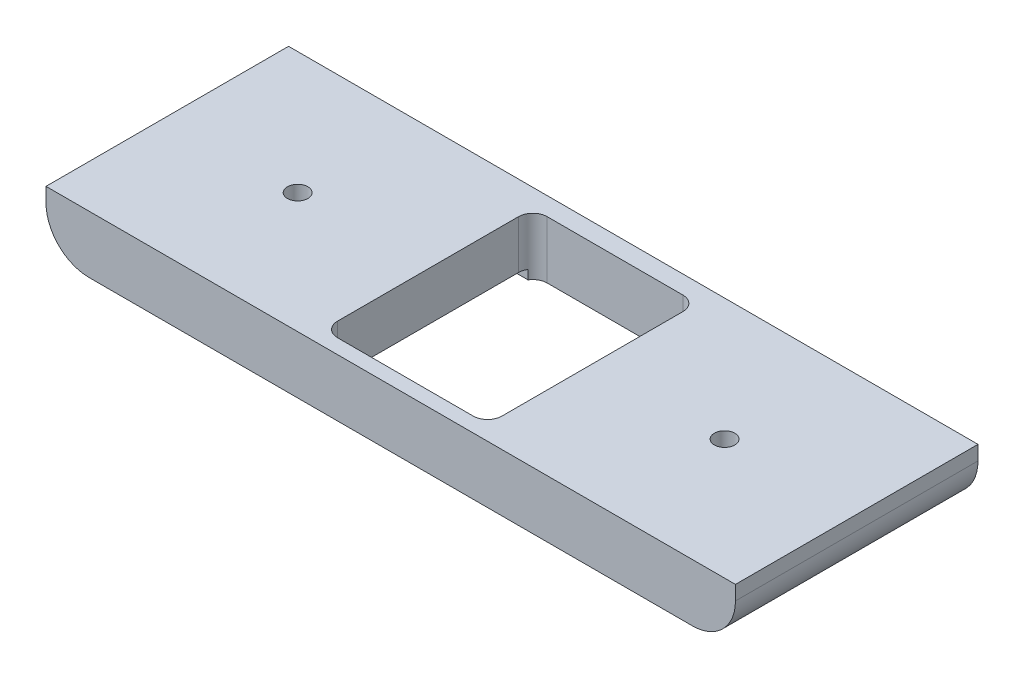
ISO-10303-21;
HEADER;
FILE_DESCRIPTION(('STEP AP214'),'2;1');
FILE_NAME('part.step','',(''),(''),'','','');
FILE_SCHEMA(('AUTOMOTIVE_DESIGN { 1 0 10303 214 1 1 1 1 }'));
ENDSEC;
DATA;
#1=APPLICATION_CONTEXT('core data for automotive mechanical design processes');
#2=APPLICATION_PROTOCOL_DEFINITION('international standard','automotive_design',2000,#1);
#3=PRODUCT_CONTEXT('',#1,'mechanical');
#4=PRODUCT('Part','Part','',(#3));
#5=PRODUCT_RELATED_PRODUCT_CATEGORY('part','',(#4));
#6=PRODUCT_DEFINITION_FORMATION('','',#4);
#7=PRODUCT_DEFINITION_CONTEXT('part definition',#1,'design');
#8=PRODUCT_DEFINITION('design','',#6,#7);
#9=PRODUCT_DEFINITION_SHAPE('','',#8);
#10=(LENGTH_UNIT() NAMED_UNIT(*) SI_UNIT(.MILLI.,.METRE.));
#11=(NAMED_UNIT(*) PLANE_ANGLE_UNIT() SI_UNIT($,.RADIAN.));
#12=(NAMED_UNIT(*) SI_UNIT($,.STERADIAN.) SOLID_ANGLE_UNIT());
#13=UNCERTAINTY_MEASURE_WITH_UNIT(LENGTH_MEASURE(1.E-05),#10,'distance_accuracy_value','');
#14=(GEOMETRIC_REPRESENTATION_CONTEXT(3) GLOBAL_UNCERTAINTY_ASSIGNED_CONTEXT((#13)) GLOBAL_UNIT_ASSIGNED_CONTEXT((#10,
#11,#12)) REPRESENTATION_CONTEXT('',''));
#15=CARTESIAN_POINT('',(0.,0.,0.));
#16=DIRECTION('',(0.,0.,1.));
#17=DIRECTION('',(1.,0.,0.));
#18=AXIS2_PLACEMENT_3D('',#15,#16,#17);
#19=CARTESIAN_POINT('',(-58.9313034977755,0.,4.12929788129206));
#20=DIRECTION('',(0.,0.,1.));
#21=DIRECTION('',(1.,0.,0.));
#22=AXIS2_PLACEMENT_3D('',#19,#20,#21);
#23=PLANE('',#22);
#24=DIRECTION('',(1.,0.,0.));
#25=VECTOR('',#24,1.);
#26=CARTESIAN_POINT('',(-58.9313034977755,0.,4.12929788129206));
#27=LINE('',#26,#25);
#28=CARTESIAN_POINT('',(-11.9750102956986,0.,4.12929788129206));
#29=VERTEX_POINT('',#28);
#30=CARTESIAN_POINT('',(12.5061965022245,0.,4.12929788129206));
#31=VERTEX_POINT('',#30);
#32=EDGE_CURVE('E271',#29,#31,#27,.T.);
#33=ORIENTED_EDGE('',*,*,#32,.F.);
#34=DIRECTION('',(0.,-1.,0.));
#35=VECTOR('',#34,1.);
#36=CARTESIAN_POINT('',(-11.9750102956986,6.35,4.12929788129206));
#37=LINE('',#36,#35);
#38=CARTESIAN_POINT('',(-11.9750102956986,1.,4.12929788129206));
#39=VERTEX_POINT('',#38);
#40=EDGE_CURVE('E193',#29,#39,#37,.F.);
#41=ORIENTED_EDGE('',*,*,#40,.T.);
#42=DIRECTION('',(1.,0.,0.));
#43=VECTOR('',#42,1.);
#44=CARTESIAN_POINT('',(-58.9313034977755,1.,4.12929788129206));
#45=LINE('',#44,#43);
#46=CARTESIAN_POINT('',(15.4259567663557,1.,4.12929788129206));
#47=VERTEX_POINT('',#46);
#48=EDGE_CURVE('E275',#39,#47,#45,.T.);
#49=ORIENTED_EDGE('',*,*,#48,.T.);
#50=CARTESIAN_POINT('',(12.5061965022245,4.7625,4.12929788129206));
#51=DIRECTION('',(0.,0.,1.));
#52=DIRECTION('',(1.,0.,0.));
#53=AXIS2_PLACEMENT_3D('',#50,#51,#52);
#54=CIRCLE('',#53,4.7625);
#55=EDGE_CURVE('E288',#47,#31,#54,.F.);
#56=ORIENTED_EDGE('',*,*,#55,.T.);
#57=EDGE_LOOP('',(#33,#41,#49,#56));
#58=FACE_BOUND('',#57,.T.);
#59=ADVANCED_FACE('F36',(#58),#23,.F.);
#60=CARTESIAN_POINT('',(-58.9313034977755,1.,4.12929788129206));
#61=DIRECTION('',(0.,1.,0.));
#62=DIRECTION('',(0.,0.,1.));
#63=AXIS2_PLACEMENT_3D('',#60,#61,#62);
#64=PLANE('',#63);
#65=CARTESIAN_POINT('',(2.76244650222446,1.,-6.79492086870787));
#66=DIRECTION('',(0.,1.,0.));
#67=DIRECTION('',(0.,0.,1.));
#68=AXIS2_PLACEMENT_3D('',#65,#66,#67);
#69=CIRCLE('',#68,1.13029999999999);
#70=CARTESIAN_POINT('',(2.76244650222446,1.,-5.66462086870788));
#71=VERTEX_POINT('',#70);
#72=EDGE_CURVE('E198',#71,#71,#69,.T.);
#73=ORIENTED_EDGE('',*,*,#72,.T.);
#74=EDGE_LOOP('',(#73));
#75=FACE_BOUND('',#74,.T.);
#76=ORIENTED_EDGE('',*,*,#48,.F.);
#77=CARTESIAN_POINT('',(-13.3313034977755,1.,3.30429788129209));
#78=DIRECTION('',(0.,1.,0.));
#79=DIRECTION('',(0.,0.,1.));
#80=AXIS2_PLACEMENT_3D('',#77,#78,#79);
#81=CIRCLE('',#80,1.5875);
#82=CARTESIAN_POINT('',(-11.7438034977755,1.,3.30429788129209));
#83=VERTEX_POINT('',#82);
#84=EDGE_CURVE('E12',#39,#83,#81,.T.);
#85=ORIENTED_EDGE('',*,*,#84,.T.);
#86=DIRECTION('',(0.,0.,-1.));
#87=VECTOR('',#86,1.);
#88=CARTESIAN_POINT('',(-11.7438034977755,1.,4.12929788129205));
#89=LINE('',#88,#87);
#90=CARTESIAN_POINT('',(-11.7438034977756,1.,-16.6957021187079));
#91=VERTEX_POINT('',#90);
#92=EDGE_CURVE('E45',#83,#91,#89,.T.);
#93=ORIENTED_EDGE('',*,*,#92,.T.);
#94=CARTESIAN_POINT('',(-13.3313034977755,1.,-16.6957021187079));
#95=DIRECTION('',(0.,1.,0.));
#96=DIRECTION('',(0.,0.,1.));
#97=AXIS2_PLACEMENT_3D('',#94,#95,#96);
#98=CIRCLE('',#97,1.5875);
#99=CARTESIAN_POINT('',(-11.9750102956987,1.,-17.5207021187079));
#100=VERTEX_POINT('',#99);
#101=EDGE_CURVE('E260',#91,#100,#98,.T.);
#102=ORIENTED_EDGE('',*,*,#101,.T.);
#103=DIRECTION('',(1.,0.,0.));
#104=VECTOR('',#103,1.);
#105=CARTESIAN_POINT('',(-58.9313034977755,1.,-17.5207021187079));
#106=LINE('',#105,#104);
#107=CARTESIAN_POINT('',(15.4259567663557,1.,-17.5207021187079));
#108=VERTEX_POINT('',#107);
#109=EDGE_CURVE('E279',#100,#108,#106,.T.);
#110=ORIENTED_EDGE('',*,*,#109,.T.);
#111=DIRECTION('',(0.,0.,-1.));
#112=VECTOR('',#111,1.);
#113=CARTESIAN_POINT('',(15.4259567663557,1.,-20.2988271187079));
#114=LINE('',#113,#112);
#115=EDGE_CURVE('E285',#108,#47,#114,.F.);
#116=ORIENTED_EDGE('',*,*,#115,.T.);
#117=EDGE_LOOP('',(#76,#85,#93,#102,#110,#116));
#118=FACE_BOUND('',#117,.T.);
#119=ADVANCED_FACE('F361',(#75,#118),#64,.F.);
#120=CARTESIAN_POINT('',(-58.9313034977755,1.,-17.5207021187079));
#121=DIRECTION('',(0.,0.,-1.));
#122=DIRECTION('',(-1.,0.,0.));
#123=AXIS2_PLACEMENT_3D('',#120,#121,#122);
#124=PLANE('',#123);
#125=ORIENTED_EDGE('',*,*,#109,.F.);
#126=DIRECTION('',(0.,-1.,0.));
#127=VECTOR('',#126,1.);
#128=CARTESIAN_POINT('',(-11.9750102956987,6.35,-17.5207021187079));
#129=LINE('',#128,#127);
#130=CARTESIAN_POINT('',(-11.9750102956987,0.,-17.5207021187079));
#131=VERTEX_POINT('',#130);
#132=EDGE_CURVE('E349',#100,#131,#129,.T.);
#133=ORIENTED_EDGE('',*,*,#132,.T.);
#134=DIRECTION('',(1.,0.,0.));
#135=VECTOR('',#134,1.);
#136=CARTESIAN_POINT('',(-58.9313034977755,0.,-17.5207021187079));
#137=LINE('',#136,#135);
#138=CARTESIAN_POINT('',(12.5061965022245,0.,-17.5207021187079));
#139=VERTEX_POINT('',#138);
#140=EDGE_CURVE('E267',#131,#139,#137,.T.);
#141=ORIENTED_EDGE('',*,*,#140,.T.);
#142=CARTESIAN_POINT('',(12.5061965022245,4.7625,-17.5207021187079));
#143=DIRECTION('',(0.,0.,-1.));
#144=DIRECTION('',(-1.,0.,0.));
#145=AXIS2_PLACEMENT_3D('',#142,#143,#144);
#146=CIRCLE('',#145,4.7625);
#147=EDGE_CURVE('E270',#139,#108,#146,.F.);
#148=ORIENTED_EDGE('',*,*,#147,.T.);
#149=EDGE_LOOP('',(#125,#133,#141,#148));
#150=FACE_BOUND('',#149,.T.);
#151=ADVANCED_FACE('F376',(#150),#124,.F.);
#152=CARTESIAN_POINT('',(17.2686965022244,0.,6.51054788129208));
#153=DIRECTION('',(0.,1.,0.));
#154=DIRECTION('',(0.,0.,1.));
#155=AXIS2_PLACEMENT_3D('',#152,#153,#154);
#156=PLANE('',#155);
#157=DIRECTION('',(-1.,0.,0.));
#158=VECTOR('',#157,1.);
#159=CARTESIAN_POINT('',(-28.3313034977755,0.,4.89179788129209));
#160=LINE('',#159,#158);
#161=CARTESIAN_POINT('',(-13.3313034977755,0.,4.89179788129209));
#162=VERTEX_POINT('',#161);
#163=CARTESIAN_POINT('',(-28.3313034977755,0.,4.89179788129209));
#164=VERTEX_POINT('',#163);
#165=EDGE_CURVE('E197',#162,#164,#160,.T.);
#166=ORIENTED_EDGE('',*,*,#165,.F.);
#167=CARTESIAN_POINT('',(-13.3313034977755,0.,3.30429788129209));
#168=DIRECTION('',(0.,-1.,0.));
#169=DIRECTION('',(0.,0.,-1.));
#170=AXIS2_PLACEMENT_3D('',#167,#168,#169);
#171=CIRCLE('',#170,1.5875);
#172=EDGE_CURVE('E186',#29,#162,#171,.T.);
#173=ORIENTED_EDGE('',*,*,#172,.F.);
#174=ORIENTED_EDGE('',*,*,#32,.T.);
#175=DIRECTION('',(0.,0.,-1.));
#176=VECTOR('',#175,1.);
#177=CARTESIAN_POINT('',(12.5061965022245,0.,6.51054788129208));
#178=LINE('',#177,#176);
#179=CARTESIAN_POINT('',(12.5061965022244,0.,6.51054788129208));
#180=VERTEX_POINT('',#179);
#181=EDGE_CURVE('E329',#31,#180,#178,.F.);
#182=ORIENTED_EDGE('',*,*,#181,.T.);
#183=DIRECTION('',(1.,0.,0.));
#184=VECTOR('',#183,1.);
#185=CARTESIAN_POINT('',(-58.9313034977755,0.,6.51054788129208));
#186=LINE('',#185,#184);
#187=CARTESIAN_POINT('',(-54.1688034977755,0.,6.51054788129208));
#188=VERTEX_POINT('',#187);
#189=EDGE_CURVE('E296',#188,#180,#186,.T.);
#190=ORIENTED_EDGE('',*,*,#189,.F.);
#191=DIRECTION('',(0.,0.,1.));
#192=VECTOR('',#191,1.);
#193=CARTESIAN_POINT('',(-54.1688034977755,0.,6.51054788129208));
#194=LINE('',#193,#192);
#195=CARTESIAN_POINT('',(-54.1688034977755,0.,4.12929788129206));
#196=VERTEX_POINT('',#195);
#197=EDGE_CURVE('E326',#188,#196,#194,.F.);
#198=ORIENTED_EDGE('',*,*,#197,.T.);
#199=CARTESIAN_POINT('',(-29.6875966998525,0.,4.12929788129206));
#200=VERTEX_POINT('',#199);
#201=EDGE_CURVE('E268',#196,#200,#27,.T.);
#202=ORIENTED_EDGE('',*,*,#201,.T.);
#203=CARTESIAN_POINT('',(-28.3313034977755,0.,3.30429788129209));
#204=DIRECTION('',(0.,-1.,0.));
#205=DIRECTION('',(0.,0.,-1.));
#206=AXIS2_PLACEMENT_3D('',#203,#204,#205);
#207=CIRCLE('',#206,1.5875);
#208=EDGE_CURVE('E212',#164,#200,#207,.T.);
#209=ORIENTED_EDGE('',*,*,#208,.F.);
#210=EDGE_LOOP('',(#166,#173,#174,#182,#190,#198,#202,#209));
#211=FACE_BOUND('',#210,.T.);
#212=ADVANCED_FACE('F210',(#211),#156,.F.);
#213=CARTESIAN_POINT('',(17.2686965022245,6.35,-20.2988271187079));
#214=DIRECTION('',(-1.,0.,0.));
#215=DIRECTION('',(0.,0.,1.));
#216=AXIS2_PLACEMENT_3D('',#213,#214,#215);
#217=PLANE('',#216);
#218=DIRECTION('',(0.,-1.,0.));
#219=VECTOR('',#218,1.);
#220=CARTESIAN_POINT('',(17.2686965022245,6.35,6.51054788129208));
#221=LINE('',#220,#219);
#222=CARTESIAN_POINT('',(17.2686965022245,6.35,6.51054788129208));
#223=VERTEX_POINT('',#222);
#224=CARTESIAN_POINT('',(17.2686965022245,4.7625,6.51054788129208));
#225=VERTEX_POINT('',#224);
#226=EDGE_CURVE('E302',#223,#225,#221,.T.);
#227=ORIENTED_EDGE('',*,*,#226,.T.);
#228=DIRECTION('',(0.,0.,-1.));
#229=VECTOR('',#228,1.);
#230=CARTESIAN_POINT('',(17.2686965022245,4.7625,-20.2988271187079));
#231=LINE('',#230,#229);
#232=CARTESIAN_POINT('',(17.2686965022245,4.7625,-20.2988271187079));
#233=VERTEX_POINT('',#232);
#234=EDGE_CURVE('E318',#225,#233,#231,.T.);
#235=ORIENTED_EDGE('',*,*,#234,.T.);
#236=DIRECTION('',(0.,-1.,0.));
#237=VECTOR('',#236,1.);
#238=CARTESIAN_POINT('',(17.2686965022245,6.35,-20.2988271187079));
#239=LINE('',#238,#237);
#240=CARTESIAN_POINT('',(17.2686965022245,6.35,-20.2988271187079));
#241=VERTEX_POINT('',#240);
#242=EDGE_CURVE('E315',#241,#233,#239,.T.);
#243=ORIENTED_EDGE('',*,*,#242,.F.);
#244=DIRECTION('',(0.,0.,-1.));
#245=VECTOR('',#244,1.);
#246=CARTESIAN_POINT('',(17.2686965022245,6.35,-20.2988271187079));
#247=LINE('',#246,#245);
#248=EDGE_CURVE('E292',#223,#241,#247,.T.);
#249=ORIENTED_EDGE('',*,*,#248,.F.);
#250=EDGE_LOOP('',(#227,#235,#243,#249));
#251=FACE_BOUND('',#250,.T.);
#252=ADVANCED_FACE('F398',(#251),#217,.F.);
#253=CARTESIAN_POINT('',(-58.9313034977755,6.35,-20.2988271187079));
#254=DIRECTION('',(0.,0.,1.));
#255=DIRECTION('',(1.,0.,0.));
#256=AXIS2_PLACEMENT_3D('',#253,#254,#255);
#257=PLANE('',#256);
#258=ORIENTED_EDGE('',*,*,#242,.T.);
#259=CARTESIAN_POINT('',(12.5061965022245,4.7625,-20.2988271187079));
#260=DIRECTION('',(0.,0.,1.));
#261=DIRECTION('',(1.,0.,0.));
#262=AXIS2_PLACEMENT_3D('',#259,#260,#261);
#263=CIRCLE('',#262,4.7625);
#264=CARTESIAN_POINT('',(12.5061965022244,0.,-20.2988271187079));
#265=VERTEX_POINT('',#264);
#266=EDGE_CURVE('E323',#233,#265,#263,.F.);
#267=ORIENTED_EDGE('',*,*,#266,.T.);
#268=DIRECTION('',(-1.,0.,0.));
#269=VECTOR('',#268,1.);
#270=CARTESIAN_POINT('',(-58.9313034977755,0.,-20.2988271187079));
#271=LINE('',#270,#269);
#272=CARTESIAN_POINT('',(-54.1688034977755,0.,-20.2988271187079));
#273=VERTEX_POINT('',#272);
#274=EDGE_CURVE('E291',#265,#273,#271,.T.);
#275=ORIENTED_EDGE('',*,*,#274,.T.);
#276=CARTESIAN_POINT('',(-54.1688034977755,4.7625,-20.2988271187079));
#277=DIRECTION('',(0.,0.,1.));
#278=DIRECTION('',(1.,0.,0.));
#279=AXIS2_PLACEMENT_3D('',#276,#277,#278);
#280=CIRCLE('',#279,4.7625);
#281=CARTESIAN_POINT('',(-58.9313034977755,4.7625,-20.2988271187079));
#282=VERTEX_POINT('',#281);
#283=EDGE_CURVE('E321',#273,#282,#280,.F.);
#284=ORIENTED_EDGE('',*,*,#283,.T.);
#285=DIRECTION('',(0.,-1.,0.));
#286=VECTOR('',#285,1.);
#287=CARTESIAN_POINT('',(-58.9313034977755,6.35,-20.2988271187079));
#288=LINE('',#287,#286);
#289=CARTESIAN_POINT('',(-58.9313034977755,6.35,-20.2988271187079));
#290=VERTEX_POINT('',#289);
#291=EDGE_CURVE('E312',#290,#282,#288,.T.);
#292=ORIENTED_EDGE('',*,*,#291,.F.);
#293=DIRECTION('',(-1.,0.,0.));
#294=VECTOR('',#293,1.);
#295=CARTESIAN_POINT('',(-58.9313034977755,6.35,-20.2988271187079));
#296=LINE('',#295,#294);
#297=EDGE_CURVE('E295',#241,#290,#296,.T.);
#298=ORIENTED_EDGE('',*,*,#297,.F.);
#299=EDGE_LOOP('',(#258,#267,#275,#284,#292,#298));
#300=FACE_BOUND('',#299,.T.);
#301=ADVANCED_FACE('F401',(#300),#257,.F.);
#302=CARTESIAN_POINT('',(-58.9313034977755,6.35,-20.2988271187079));
#303=DIRECTION('',(1.,0.,0.));
#304=DIRECTION('',(0.,0.,-1.));
#305=AXIS2_PLACEMENT_3D('',#302,#303,#304);
#306=PLANE('',#305);
#307=ORIENTED_EDGE('',*,*,#291,.T.);
#308=DIRECTION('',(0.,0.,1.));
#309=VECTOR('',#308,1.);
#310=CARTESIAN_POINT('',(-58.9313034977755,4.7625,-20.2988271187079));
#311=LINE('',#310,#309);
#312=CARTESIAN_POINT('',(-58.9313034977755,4.7625,6.51054788129208));
#313=VERTEX_POINT('',#312);
#314=EDGE_CURVE('E337',#282,#313,#311,.T.);
#315=ORIENTED_EDGE('',*,*,#314,.T.);
#316=DIRECTION('',(0.,-1.,0.));
#317=VECTOR('',#316,1.);
#318=CARTESIAN_POINT('',(-58.9313034977755,6.35,6.51054788129208));
#319=LINE('',#318,#317);
#320=CARTESIAN_POINT('',(-58.9313034977755,6.35,6.51054788129208));
#321=VERTEX_POINT('',#320);
#322=EDGE_CURVE('E309',#321,#313,#319,.T.);
#323=ORIENTED_EDGE('',*,*,#322,.F.);
#324=DIRECTION('',(0.,0.,1.));
#325=VECTOR('',#324,1.);
#326=CARTESIAN_POINT('',(-58.9313034977755,6.35,-20.2988271187079));
#327=LINE('',#326,#325);
#328=EDGE_CURVE('E298',#290,#321,#327,.T.);
#329=ORIENTED_EDGE('',*,*,#328,.F.);
#330=EDGE_LOOP('',(#307,#315,#323,#329));
#331=FACE_BOUND('',#330,.T.);
#332=ADVANCED_FACE('F407',(#331),#306,.F.);
#333=CARTESIAN_POINT('',(-58.9313034977755,6.35,6.51054788129208));
#334=DIRECTION('',(0.,0.,-1.));
#335=DIRECTION('',(-1.,0.,0.));
#336=AXIS2_PLACEMENT_3D('',#333,#334,#335);
#337=PLANE('',#336);
#338=ORIENTED_EDGE('',*,*,#189,.T.);
#339=CARTESIAN_POINT('',(12.5061965022245,4.7625,6.51054788129208));
#340=DIRECTION('',(0.,0.,-1.));
#341=DIRECTION('',(-1.,0.,0.));
#342=AXIS2_PLACEMENT_3D('',#339,#340,#341);
#343=CIRCLE('',#342,4.7625);
#344=EDGE_CURVE('E335',#180,#225,#343,.F.);
#345=ORIENTED_EDGE('',*,*,#344,.T.);
#346=ORIENTED_EDGE('',*,*,#226,.F.);
#347=DIRECTION('',(1.,0.,0.));
#348=VECTOR('',#347,1.);
#349=CARTESIAN_POINT('',(-58.9313034977755,6.35,6.51054788129208));
#350=LINE('',#349,#348);
#351=EDGE_CURVE('E300',#321,#223,#350,.T.);
#352=ORIENTED_EDGE('',*,*,#351,.F.);
#353=ORIENTED_EDGE('',*,*,#322,.T.);
#354=CARTESIAN_POINT('',(-54.1688034977755,4.7625,6.51054788129208));
#355=DIRECTION('',(0.,0.,-1.));
#356=DIRECTION('',(-1.,0.,0.));
#357=AXIS2_PLACEMENT_3D('',#354,#355,#356);
#358=CIRCLE('',#357,4.7625);
#359=EDGE_CURVE('E333',#313,#188,#358,.F.);
#360=ORIENTED_EDGE('',*,*,#359,.T.);
#361=EDGE_LOOP('',(#338,#345,#346,#352,#353,#360));
#362=FACE_BOUND('',#361,.T.);
#363=ADVANCED_FACE('F394',(#362),#337,.F.);
#364=CARTESIAN_POINT('',(17.2686965022244,6.35,6.51054788129208));
#365=DIRECTION('',(0.,1.,0.));
#366=DIRECTION('',(0.,0.,1.));
#367=AXIS2_PLACEMENT_3D('',#364,#365,#366);
#368=PLANE('',#367);
#369=CARTESIAN_POINT('',(-44.4250534977756,6.35,-6.79492086870792));
#370=DIRECTION('',(0.,1.,0.));
#371=DIRECTION('',(0.,0.,1.));
#372=AXIS2_PLACEMENT_3D('',#369,#370,#371);
#373=CIRCLE('',#372,1.13029999999999);
#374=CARTESIAN_POINT('',(-44.4250534977756,6.35,-5.66462086870793));
#375=VERTEX_POINT('',#374);
#376=EDGE_CURVE('E475',#375,#375,#373,.T.);
#377=ORIENTED_EDGE('',*,*,#376,.F.);
#378=EDGE_LOOP('',(#377));
#379=FACE_BOUND('',#378,.T.);
#380=CARTESIAN_POINT('',(2.76244650222446,6.35,-6.79492086870787));
#381=DIRECTION('',(0.,1.,0.));
#382=DIRECTION('',(0.,0.,1.));
#383=AXIS2_PLACEMENT_3D('',#380,#381,#382);
#384=CIRCLE('',#383,1.13029999999999);
#385=CARTESIAN_POINT('',(2.76244650222446,6.35,-5.66462086870789));
#386=VERTEX_POINT('',#385);
#387=EDGE_CURVE('E478',#386,#386,#384,.T.);
#388=ORIENTED_EDGE('',*,*,#387,.F.);
#389=EDGE_LOOP('',(#388));
#390=FACE_BOUND('',#389,.T.);
#391=CARTESIAN_POINT('',(-13.3313034977755,6.35,3.30429788129209));
#392=DIRECTION('',(0.,-1.,0.));
#393=DIRECTION('',(0.,0.,-1.));
#394=AXIS2_PLACEMENT_3D('',#391,#392,#393);
#395=CIRCLE('',#394,1.5875);
#396=CARTESIAN_POINT('',(-11.7438034977755,6.35,3.30429788129209));
#397=VERTEX_POINT('',#396);
#398=CARTESIAN_POINT('',(-13.3313034977755,6.35,4.89179788129209));
#399=VERTEX_POINT('',#398);
#400=EDGE_CURVE('E224',#397,#399,#395,.T.);
#401=ORIENTED_EDGE('',*,*,#400,.T.);
#402=DIRECTION('',(-1.,0.,0.));
#403=VECTOR('',#402,1.);
#404=CARTESIAN_POINT('',(-28.3313034977755,6.35,4.89179788129209));
#405=LINE('',#404,#403);
#406=CARTESIAN_POINT('',(-28.3313034977755,6.35,4.89179788129209));
#407=VERTEX_POINT('',#406);
#408=EDGE_CURVE('E205',#399,#407,#405,.T.);
#409=ORIENTED_EDGE('',*,*,#408,.T.);
#410=CARTESIAN_POINT('',(-28.3313034977755,6.35,3.30429788129209));
#411=DIRECTION('',(0.,-1.,0.));
#412=DIRECTION('',(0.,0.,-1.));
#413=AXIS2_PLACEMENT_3D('',#410,#411,#412);
#414=CIRCLE('',#413,1.5875);
#415=CARTESIAN_POINT('',(-29.9188034977755,6.35,3.30429788129209));
#416=VERTEX_POINT('',#415);
#417=EDGE_CURVE('E52',#407,#416,#414,.T.);
#418=ORIENTED_EDGE('',*,*,#417,.T.);
#419=DIRECTION('',(0.,0.,-1.));
#420=VECTOR('',#419,1.);
#421=CARTESIAN_POINT('',(-29.9188034977755,6.35,-16.6957021187079));
#422=LINE('',#421,#420);
#423=CARTESIAN_POINT('',(-29.9188034977755,6.35,-16.6957021187079));
#424=VERTEX_POINT('',#423);
#425=EDGE_CURVE('E228',#416,#424,#422,.T.);
#426=ORIENTED_EDGE('',*,*,#425,.T.);
#427=CARTESIAN_POINT('',(-28.3313034977755,6.35,-16.6957021187079));
#428=DIRECTION('',(0.,-1.,0.));
#429=DIRECTION('',(0.,0.,-1.));
#430=AXIS2_PLACEMENT_3D('',#427,#428,#429);
#431=CIRCLE('',#430,1.5875);
#432=CARTESIAN_POINT('',(-28.3313034977755,6.35,-18.2832021187079));
#433=VERTEX_POINT('',#432);
#434=EDGE_CURVE('E231',#424,#433,#431,.T.);
#435=ORIENTED_EDGE('',*,*,#434,.T.);
#436=DIRECTION('',(1.,0.,0.));
#437=VECTOR('',#436,1.);
#438=CARTESIAN_POINT('',(-13.3313034977755,6.35,-18.2832021187079));
#439=LINE('',#438,#437);
#440=CARTESIAN_POINT('',(-13.3313034977755,6.35,-18.2832021187079));
#441=VERTEX_POINT('',#440);
#442=EDGE_CURVE('E234',#433,#441,#439,.T.);
#443=ORIENTED_EDGE('',*,*,#442,.T.);
#444=CARTESIAN_POINT('',(-13.3313034977755,6.35,-16.6957021187079));
#445=DIRECTION('',(0.,-1.,0.));
#446=DIRECTION('',(0.,0.,-1.));
#447=AXIS2_PLACEMENT_3D('',#444,#445,#446);
#448=CIRCLE('',#447,1.5875);
#449=CARTESIAN_POINT('',(-11.7438034977756,6.35,-16.6957021187079));
#450=VERTEX_POINT('',#449);
#451=EDGE_CURVE('E237',#441,#450,#448,.T.);
#452=ORIENTED_EDGE('',*,*,#451,.T.);
#453=DIRECTION('',(0.,0.,1.));
#454=VECTOR('',#453,1.);
#455=CARTESIAN_POINT('',(-11.7438034977755,6.35,3.30429788129209));
#456=LINE('',#455,#454);
#457=EDGE_CURVE('E208',#450,#397,#456,.T.);
#458=ORIENTED_EDGE('',*,*,#457,.T.);
#459=EDGE_LOOP('',(#401,#409,#418,#426,#435,#443,#452,#458));
#460=FACE_BOUND('',#459,.T.);
#461=ORIENTED_EDGE('',*,*,#248,.T.);
#462=ORIENTED_EDGE('',*,*,#297,.T.);
#463=ORIENTED_EDGE('',*,*,#328,.T.);
#464=ORIENTED_EDGE('',*,*,#351,.T.);
#465=EDGE_LOOP('',(#461,#462,#463,#464));
#466=FACE_BOUND('',#465,.T.);
#467=ADVANCED_FACE('F367',(#379,#390,#460,#466),#368,.T.);
#468=ORIENTED_EDGE('',*,*,#140,.F.);
#469=CARTESIAN_POINT('',(-13.3313034977755,0.,-16.6957021187079));
#470=DIRECTION('',(0.,-1.,0.));
#471=DIRECTION('',(0.,0.,-1.));
#472=AXIS2_PLACEMENT_3D('',#469,#470,#471);
#473=CIRCLE('',#472,1.5875);
#474=CARTESIAN_POINT('',(-13.3313034977755,0.,-18.2832021187079));
#475=VERTEX_POINT('',#474);
#476=EDGE_CURVE('E222',#475,#131,#473,.T.);
#477=ORIENTED_EDGE('',*,*,#476,.F.);
#478=DIRECTION('',(1.,0.,0.));
#479=VECTOR('',#478,1.);
#480=CARTESIAN_POINT('',(-13.3313034977755,0.,-18.2832021187079));
#481=LINE('',#480,#479);
#482=CARTESIAN_POINT('',(-28.3313034977755,0.,-18.2832021187079));
#483=VERTEX_POINT('',#482);
#484=EDGE_CURVE('E219',#483,#475,#481,.T.);
#485=ORIENTED_EDGE('',*,*,#484,.F.);
#486=CARTESIAN_POINT('',(-28.3313034977755,0.,-16.6957021187079));
#487=DIRECTION('',(0.,-1.,0.));
#488=DIRECTION('',(0.,0.,-1.));
#489=AXIS2_PLACEMENT_3D('',#486,#487,#488);
#490=CIRCLE('',#489,1.5875);
#491=CARTESIAN_POINT('',(-29.6875966998524,0.,-17.5207021187079));
#492=VERTEX_POINT('',#491);
#493=EDGE_CURVE('E214',#492,#483,#490,.T.);
#494=ORIENTED_EDGE('',*,*,#493,.F.);
#495=CARTESIAN_POINT('',(-54.1688034977755,0.,-17.5207021187079));
#496=VERTEX_POINT('',#495);
#497=EDGE_CURVE('E280',#496,#492,#137,.T.);
#498=ORIENTED_EDGE('',*,*,#497,.F.);
#499=EDGE_CURVE('E325',#496,#273,#194,.F.);
#500=ORIENTED_EDGE('',*,*,#499,.T.);
#501=ORIENTED_EDGE('',*,*,#274,.F.);
#502=EDGE_CURVE('E330',#265,#139,#178,.F.);
#503=ORIENTED_EDGE('',*,*,#502,.T.);
#504=EDGE_LOOP('',(#468,#477,#485,#494,#498,#500,#501,#503));
#505=FACE_BOUND('',#504,.T.);
#506=ADVANCED_FACE('F379',(#505),#156,.F.);
#507=CARTESIAN_POINT('',(12.5061965022245,4.7625,-20.2988271187079));
#508=DIRECTION('',(0.,0.,-1.));
#509=DIRECTION('',(-1.,0.,0.));
#510=AXIS2_PLACEMENT_3D('',#507,#508,#509);
#511=CYLINDRICAL_SURFACE('',#510,4.7625);
#512=ORIENTED_EDGE('',*,*,#55,.F.);
#513=ORIENTED_EDGE('',*,*,#115,.F.);
#514=ORIENTED_EDGE('',*,*,#147,.F.);
#515=ORIENTED_EDGE('',*,*,#502,.F.);
#516=ORIENTED_EDGE('',*,*,#266,.F.);
#517=ORIENTED_EDGE('',*,*,#234,.F.);
#518=ORIENTED_EDGE('',*,*,#344,.F.);
#519=ORIENTED_EDGE('',*,*,#181,.F.);
#520=EDGE_LOOP('',(#512,#513,#514,#515,#516,#517,#518,#519));
#521=FACE_BOUND('',#520,.T.);
#522=ADVANCED_FACE('F385',(#521),#511,.T.);
#523=CARTESIAN_POINT('',(-54.1688034977755,4.7625,-20.2988271187079));
#524=DIRECTION('',(0.,0.,1.));
#525=DIRECTION('',(1.,0.,0.));
#526=AXIS2_PLACEMENT_3D('',#523,#524,#525);
#527=CYLINDRICAL_SURFACE('',#526,4.7625);
#528=CARTESIAN_POINT('',(-54.1688034977755,4.7625,4.12929788129206));
#529=DIRECTION('',(0.,0.,1.));
#530=DIRECTION('',(1.,0.,0.));
#531=AXIS2_PLACEMENT_3D('',#528,#529,#530);
#532=CIRCLE('',#531,4.7625);
#533=CARTESIAN_POINT('',(-57.0885637619068,1.,4.12929788129206));
#534=VERTEX_POINT('',#533);
#535=EDGE_CURVE('E345',#196,#534,#532,.F.);
#536=ORIENTED_EDGE('',*,*,#535,.F.);
#537=ORIENTED_EDGE('',*,*,#197,.F.);
#538=ORIENTED_EDGE('',*,*,#359,.F.);
#539=ORIENTED_EDGE('',*,*,#314,.F.);
#540=ORIENTED_EDGE('',*,*,#283,.F.);
#541=ORIENTED_EDGE('',*,*,#499,.F.);
#542=CARTESIAN_POINT('',(-54.1688034977755,4.7625,-17.5207021187079));
#543=DIRECTION('',(0.,0.,-1.));
#544=DIRECTION('',(-1.,0.,0.));
#545=AXIS2_PLACEMENT_3D('',#542,#543,#544);
#546=CIRCLE('',#545,4.7625);
#547=CARTESIAN_POINT('',(-57.0885637619068,1.,-17.5207021187079));
#548=VERTEX_POINT('',#547);
#549=EDGE_CURVE('E340',#548,#496,#546,.F.);
#550=ORIENTED_EDGE('',*,*,#549,.F.);
#551=DIRECTION('',(0.,0.,1.));
#552=VECTOR('',#551,1.);
#553=CARTESIAN_POINT('',(-57.0885637619068,1.,-20.2988271187079));
#554=LINE('',#553,#552);
#555=EDGE_CURVE('E342',#534,#548,#554,.F.);
#556=ORIENTED_EDGE('',*,*,#555,.F.);
#557=EDGE_LOOP('',(#536,#537,#538,#539,#540,#541,#550,#556));
#558=FACE_BOUND('',#557,.T.);
#559=ADVANCED_FACE('F38',(#558),#527,.T.);
#560=CARTESIAN_POINT('',(-29.6875966998525,1.,4.12929788129206));
#561=VERTEX_POINT('',#560);
#562=EDGE_CURVE('E272',#534,#561,#45,.T.);
#563=ORIENTED_EDGE('',*,*,#562,.T.);
#564=DIRECTION('',(0.,-1.,0.));
#565=VECTOR('',#564,1.);
#566=CARTESIAN_POINT('',(-29.6875966998525,6.35,4.12929788129206));
#567=LINE('',#566,#565);
#568=EDGE_CURVE('E263',#561,#200,#567,.T.);
#569=ORIENTED_EDGE('',*,*,#568,.T.);
#570=ORIENTED_EDGE('',*,*,#201,.F.);
#571=ORIENTED_EDGE('',*,*,#535,.T.);
#572=EDGE_LOOP('',(#563,#569,#570,#571));
#573=FACE_BOUND('',#572,.T.);
#574=ADVANCED_FACE('F415',(#573),#23,.F.);
#575=CARTESIAN_POINT('',(-44.4250534977756,1.,-6.79492086870792));
#576=DIRECTION('',(0.,1.,0.));
#577=DIRECTION('',(0.,0.,1.));
#578=AXIS2_PLACEMENT_3D('',#575,#576,#577);
#579=CIRCLE('',#578,1.13029999999999);
#580=CARTESIAN_POINT('',(-44.4250534977756,1.,-5.66462086870793));
#581=VERTEX_POINT('',#580);
#582=EDGE_CURVE('E40',#581,#581,#579,.T.);
#583=ORIENTED_EDGE('',*,*,#582,.T.);
#584=EDGE_LOOP('',(#583));
#585=FACE_BOUND('',#584,.T.);
#586=CARTESIAN_POINT('',(-29.6875966998524,1.,-17.5207021187079));
#587=VERTEX_POINT('',#586);
#588=EDGE_CURVE('E276',#548,#587,#106,.T.);
#589=ORIENTED_EDGE('',*,*,#588,.T.);
#590=CARTESIAN_POINT('',(-28.3313034977755,1.,-16.6957021187079));
#591=DIRECTION('',(0.,1.,0.));
#592=DIRECTION('',(0.,0.,1.));
#593=AXIS2_PLACEMENT_3D('',#590,#591,#592);
#594=CIRCLE('',#593,1.5875);
#595=CARTESIAN_POINT('',(-29.9188034977755,1.,-16.6957021187079));
#596=VERTEX_POINT('',#595);
#597=EDGE_CURVE('E60',#587,#596,#594,.T.);
#598=ORIENTED_EDGE('',*,*,#597,.T.);
#599=DIRECTION('',(0.,0.,1.));
#600=VECTOR('',#599,1.);
#601=CARTESIAN_POINT('',(-29.9188034977755,1.,4.12929788129206));
#602=LINE('',#601,#600);
#603=CARTESIAN_POINT('',(-29.9188034977755,1.,3.30429788129209));
#604=VERTEX_POINT('',#603);
#605=EDGE_CURVE('E355',#596,#604,#602,.T.);
#606=ORIENTED_EDGE('',*,*,#605,.T.);
#607=CARTESIAN_POINT('',(-28.3313034977755,1.,3.30429788129209));
#608=DIRECTION('',(0.,1.,0.));
#609=DIRECTION('',(0.,0.,1.));
#610=AXIS2_PLACEMENT_3D('',#607,#608,#609);
#611=CIRCLE('',#610,1.5875);
#612=EDGE_CURVE('E352',#604,#561,#611,.T.);
#613=ORIENTED_EDGE('',*,*,#612,.T.);
#614=ORIENTED_EDGE('',*,*,#562,.F.);
#615=ORIENTED_EDGE('',*,*,#555,.T.);
#616=EDGE_LOOP('',(#589,#598,#606,#613,#614,#615));
#617=FACE_BOUND('',#616,.T.);
#618=ADVANCED_FACE('F419',(#585,#617),#64,.F.);
#619=ORIENTED_EDGE('',*,*,#497,.T.);
#620=DIRECTION('',(0.,-1.,0.));
#621=VECTOR('',#620,1.);
#622=CARTESIAN_POINT('',(-29.6875966998524,6.35,-17.5207021187079));
#623=LINE('',#622,#621);
#624=EDGE_CURVE('E347',#492,#587,#623,.F.);
#625=ORIENTED_EDGE('',*,*,#624,.T.);
#626=ORIENTED_EDGE('',*,*,#588,.F.);
#627=ORIENTED_EDGE('',*,*,#549,.T.);
#628=EDGE_LOOP('',(#619,#625,#626,#627));
#629=FACE_BOUND('',#628,.T.);
#630=ADVANCED_FACE('F430',(#629),#124,.F.);
#631=CARTESIAN_POINT('',(-13.3313034977755,6.35,3.30429788129209));
#632=DIRECTION('',(0.,-1.,0.));
#633=DIRECTION('',(0.,0.,-1.));
#634=AXIS2_PLACEMENT_3D('',#631,#632,#633);
#635=CYLINDRICAL_SURFACE('',#634,1.5875);
#636=ORIENTED_EDGE('',*,*,#172,.T.);
#637=DIRECTION('',(0.,-1.,0.));
#638=VECTOR('',#637,1.);
#639=CARTESIAN_POINT('',(-13.3313034977755,6.35,4.89179788129209));
#640=LINE('',#639,#638);
#641=EDGE_CURVE('E190',#399,#162,#640,.T.);
#642=ORIENTED_EDGE('',*,*,#641,.F.);
#643=ORIENTED_EDGE('',*,*,#400,.F.);
#644=DIRECTION('',(0.,-1.,0.));
#645=VECTOR('',#644,1.);
#646=CARTESIAN_POINT('',(-11.7438034977755,6.35,3.30429788129209));
#647=LINE('',#646,#645);
#648=EDGE_CURVE('E242',#397,#83,#647,.T.);
#649=ORIENTED_EDGE('',*,*,#648,.T.);
#650=ORIENTED_EDGE('',*,*,#84,.F.);
#651=ORIENTED_EDGE('',*,*,#40,.F.);
#652=EDGE_LOOP('',(#636,#642,#643,#649,#650,#651));
#653=FACE_BOUND('',#652,.T.);
#654=ADVANCED_FACE('F188',(#653),#635,.F.);
#655=CARTESIAN_POINT('',(-11.7438034977755,6.35,3.30429788129209));
#656=DIRECTION('',(1.,0.,0.));
#657=DIRECTION('',(0.,0.,-1.));
#658=AXIS2_PLACEMENT_3D('',#655,#656,#657);
#659=PLANE('',#658);
#660=ORIENTED_EDGE('',*,*,#648,.F.);
#661=ORIENTED_EDGE('',*,*,#457,.F.);
#662=DIRECTION('',(0.,-1.,0.));
#663=VECTOR('',#662,1.);
#664=CARTESIAN_POINT('',(-11.7438034977756,6.35,-16.6957021187079));
#665=LINE('',#664,#663);
#666=EDGE_CURVE('E245',#450,#91,#665,.T.);
#667=ORIENTED_EDGE('',*,*,#666,.T.);
#668=ORIENTED_EDGE('',*,*,#92,.F.);
#669=EDGE_LOOP('',(#660,#661,#667,#668));
#670=FACE_BOUND('',#669,.T.);
#671=ADVANCED_FACE('F364',(#670),#659,.F.);
#672=CARTESIAN_POINT('',(-29.9188034977755,6.35,-16.6957021187079));
#673=DIRECTION('',(-1.,0.,0.));
#674=DIRECTION('',(0.,0.,1.));
#675=AXIS2_PLACEMENT_3D('',#672,#673,#674);
#676=PLANE('',#675);
#677=DIRECTION('',(0.,-1.,0.));
#678=VECTOR('',#677,1.);
#679=CARTESIAN_POINT('',(-29.9188034977755,6.35,-16.6957021187079));
#680=LINE('',#679,#678);
#681=EDGE_CURVE('E253',#424,#596,#680,.T.);
#682=ORIENTED_EDGE('',*,*,#681,.F.);
#683=ORIENTED_EDGE('',*,*,#425,.F.);
#684=DIRECTION('',(0.,-1.,0.));
#685=VECTOR('',#684,1.);
#686=CARTESIAN_POINT('',(-29.9188034977755,6.35,3.30429788129209));
#687=LINE('',#686,#685);
#688=EDGE_CURVE('E255',#416,#604,#687,.T.);
#689=ORIENTED_EDGE('',*,*,#688,.T.);
#690=ORIENTED_EDGE('',*,*,#605,.F.);
#691=EDGE_LOOP('',(#682,#683,#689,#690));
#692=FACE_BOUND('',#691,.T.);
#693=ADVANCED_FACE('F421',(#692),#676,.F.);
#694=CARTESIAN_POINT('',(-28.3313034977755,6.35,3.30429788129209));
#695=DIRECTION('',(0.,-1.,0.));
#696=DIRECTION('',(0.,0.,-1.));
#697=AXIS2_PLACEMENT_3D('',#694,#695,#696);
#698=CYLINDRICAL_SURFACE('',#697,1.5875);
#699=ORIENTED_EDGE('',*,*,#612,.F.);
#700=ORIENTED_EDGE('',*,*,#688,.F.);
#701=ORIENTED_EDGE('',*,*,#417,.F.);
#702=DIRECTION('',(0.,-1.,0.));
#703=VECTOR('',#702,1.);
#704=CARTESIAN_POINT('',(-28.3313034977755,6.35,4.89179788129209));
#705=LINE('',#704,#703);
#706=EDGE_CURVE('E207',#407,#164,#705,.T.);
#707=ORIENTED_EDGE('',*,*,#706,.T.);
#708=ORIENTED_EDGE('',*,*,#208,.T.);
#709=ORIENTED_EDGE('',*,*,#568,.F.);
#710=EDGE_LOOP('',(#699,#700,#701,#707,#708,#709));
#711=FACE_BOUND('',#710,.T.);
#712=ADVANCED_FACE('F417',(#711),#698,.F.);
#713=CARTESIAN_POINT('',(-13.3313034977755,6.35,-16.6957021187079));
#714=DIRECTION('',(0.,-1.,0.));
#715=DIRECTION('',(0.,0.,-1.));
#716=AXIS2_PLACEMENT_3D('',#713,#714,#715);
#717=CYLINDRICAL_SURFACE('',#716,1.5875);
#718=ORIENTED_EDGE('',*,*,#666,.F.);
#719=ORIENTED_EDGE('',*,*,#451,.F.);
#720=DIRECTION('',(0.,-1.,0.));
#721=VECTOR('',#720,1.);
#722=CARTESIAN_POINT('',(-13.3313034977755,6.35,-18.2832021187079));
#723=LINE('',#722,#721);
#724=EDGE_CURVE('E248',#441,#475,#723,.T.);
#725=ORIENTED_EDGE('',*,*,#724,.T.);
#726=ORIENTED_EDGE('',*,*,#476,.T.);
#727=ORIENTED_EDGE('',*,*,#132,.F.);
#728=ORIENTED_EDGE('',*,*,#101,.F.);
#729=EDGE_LOOP('',(#718,#719,#725,#726,#727,#728));
#730=FACE_BOUND('',#729,.T.);
#731=ADVANCED_FACE('F372',(#730),#717,.F.);
#732=CARTESIAN_POINT('',(-28.3313034977755,6.35,-16.6957021187079));
#733=DIRECTION('',(0.,-1.,0.));
#734=DIRECTION('',(0.,0.,-1.));
#735=AXIS2_PLACEMENT_3D('',#732,#733,#734);
#736=CYLINDRICAL_SURFACE('',#735,1.5875);
#737=ORIENTED_EDGE('',*,*,#624,.F.);
#738=ORIENTED_EDGE('',*,*,#493,.T.);
#739=DIRECTION('',(0.,-1.,0.));
#740=VECTOR('',#739,1.);
#741=CARTESIAN_POINT('',(-28.3313034977755,6.35,-18.2832021187079));
#742=LINE('',#741,#740);
#743=EDGE_CURVE('E250',#433,#483,#742,.T.);
#744=ORIENTED_EDGE('',*,*,#743,.F.);
#745=ORIENTED_EDGE('',*,*,#434,.F.);
#746=ORIENTED_EDGE('',*,*,#681,.T.);
#747=ORIENTED_EDGE('',*,*,#597,.F.);
#748=EDGE_LOOP('',(#737,#738,#744,#745,#746,#747));
#749=FACE_BOUND('',#748,.T.);
#750=ADVANCED_FACE('F424',(#749),#736,.F.);
#751=CARTESIAN_POINT('',(-13.3313034977755,6.35,-18.2832021187079));
#752=DIRECTION('',(0.,0.,-1.));
#753=DIRECTION('',(-1.,0.,0.));
#754=AXIS2_PLACEMENT_3D('',#751,#752,#753);
#755=PLANE('',#754);
#756=ORIENTED_EDGE('',*,*,#724,.F.);
#757=ORIENTED_EDGE('',*,*,#442,.F.);
#758=ORIENTED_EDGE('',*,*,#743,.T.);
#759=ORIENTED_EDGE('',*,*,#484,.T.);
#760=EDGE_LOOP('',(#756,#757,#758,#759));
#761=FACE_BOUND('',#760,.T.);
#762=ADVANCED_FACE('F427',(#761),#755,.F.);
#763=CARTESIAN_POINT('',(-28.3313034977755,6.35,4.89179788129209));
#764=DIRECTION('',(0.,0.,1.));
#765=DIRECTION('',(1.,0.,0.));
#766=AXIS2_PLACEMENT_3D('',#763,#764,#765);
#767=PLANE('',#766);
#768=ORIENTED_EDGE('',*,*,#706,.F.);
#769=ORIENTED_EDGE('',*,*,#408,.F.);
#770=ORIENTED_EDGE('',*,*,#641,.T.);
#771=ORIENTED_EDGE('',*,*,#165,.T.);
#772=EDGE_LOOP('',(#768,#769,#770,#771));
#773=FACE_BOUND('',#772,.T.);
#774=ADVANCED_FACE('F202',(#773),#767,.F.);
#775=CARTESIAN_POINT('',(2.76244650222446,6.35,-6.79492086870787));
#776=DIRECTION('',(0.,1.,0.));
#777=DIRECTION('',(0.,0.,1.));
#778=AXIS2_PLACEMENT_3D('',#775,#776,#777);
#779=CYLINDRICAL_SURFACE('',#778,1.13029999999999);
#780=ORIENTED_EDGE('',*,*,#387,.T.);
#781=EDGE_LOOP('',(#780));
#782=FACE_BOUND('',#781,.T.);
#783=ORIENTED_EDGE('',*,*,#72,.F.);
#784=EDGE_LOOP('',(#783));
#785=FACE_BOUND('',#784,.T.);
#786=ADVANCED_FACE('F488',(#782,#785),#779,.F.);
#787=CARTESIAN_POINT('',(-44.4250534977756,6.35,-6.79492086870792));
#788=DIRECTION('',(0.,1.,0.));
#789=DIRECTION('',(0.,0.,1.));
#790=AXIS2_PLACEMENT_3D('',#787,#788,#789);
#791=CYLINDRICAL_SURFACE('',#790,1.13029999999999);
#792=ORIENTED_EDGE('',*,*,#376,.T.);
#793=EDGE_LOOP('',(#792));
#794=FACE_BOUND('',#793,.T.);
#795=ORIENTED_EDGE('',*,*,#582,.F.);
#796=EDGE_LOOP('',(#795));
#797=FACE_BOUND('',#796,.T.);
#798=ADVANCED_FACE('F485',(#794,#797),#791,.F.);
#799=CLOSED_SHELL('',(#59,#119,#151,#212,#252,#301,#332,#363,#467,#506,#522,#559,#574,#618,#630,
#654,#671,#693,#712,#731,#750,#762,#774,#786,#798));
#800=MANIFOLD_SOLID_BREP('B2',#799);
#801=ADVANCED_BREP_SHAPE_REPRESENTATION('',(#18,#800),#14);
#802=SHAPE_DEFINITION_REPRESENTATION(#9,#801);
ENDSEC;
END-ISO-10303-21;
